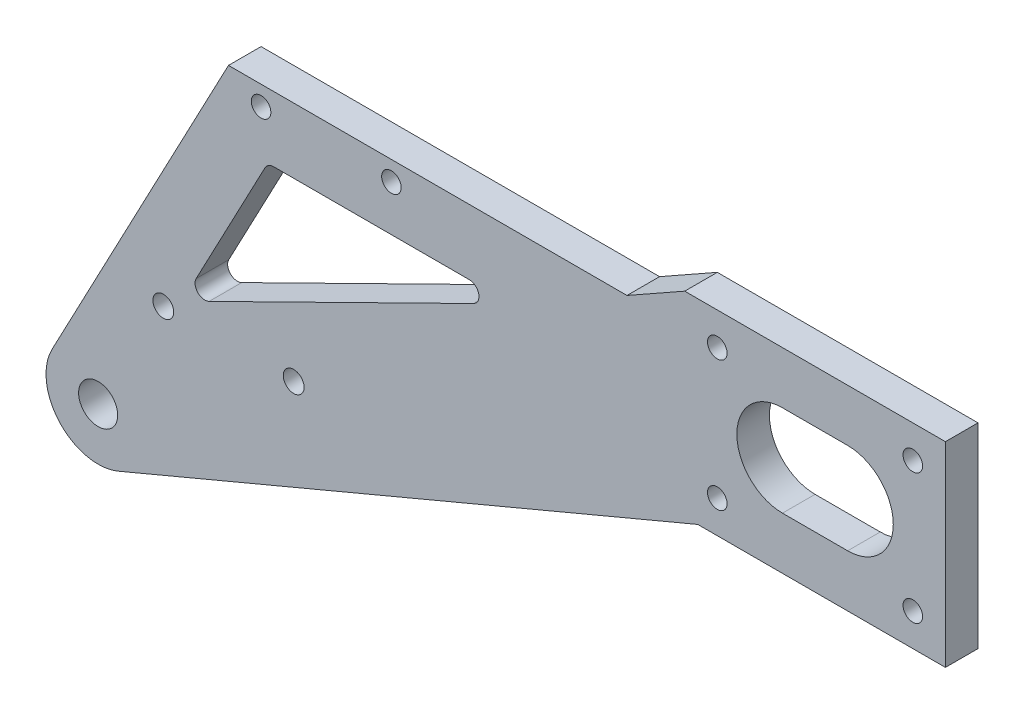
ISO-10303-21;
HEADER;
FILE_DESCRIPTION(('STEP AP214'),'2;1');
FILE_NAME('part.step','',(''),(''),'','','');
FILE_SCHEMA(('AUTOMOTIVE_DESIGN { 1 0 10303 214 1 1 1 1 }'));
ENDSEC;
DATA;
#1=APPLICATION_CONTEXT('core data for automotive mechanical design processes');
#2=APPLICATION_PROTOCOL_DEFINITION('international standard','automotive_design',2000,#1);
#3=PRODUCT_CONTEXT('',#1,'mechanical');
#4=PRODUCT('Part','Part','',(#3));
#5=PRODUCT_RELATED_PRODUCT_CATEGORY('part','',(#4));
#6=PRODUCT_DEFINITION_FORMATION('','',#4);
#7=PRODUCT_DEFINITION_CONTEXT('part definition',#1,'design');
#8=PRODUCT_DEFINITION('design','',#6,#7);
#9=PRODUCT_DEFINITION_SHAPE('','',#8);
#10=(LENGTH_UNIT() NAMED_UNIT(*) SI_UNIT(.MILLI.,.METRE.));
#11=(NAMED_UNIT(*) PLANE_ANGLE_UNIT() SI_UNIT($,.RADIAN.));
#12=(NAMED_UNIT(*) SI_UNIT($,.STERADIAN.) SOLID_ANGLE_UNIT());
#13=UNCERTAINTY_MEASURE_WITH_UNIT(LENGTH_MEASURE(1.E-05),#10,'distance_accuracy_value','');
#14=(GEOMETRIC_REPRESENTATION_CONTEXT(3) GLOBAL_UNCERTAINTY_ASSIGNED_CONTEXT((#13)) GLOBAL_UNIT_ASSIGNED_CONTEXT((#10,
#11,#12)) REPRESENTATION_CONTEXT('',''));
#15=CARTESIAN_POINT('',(0.,0.,0.));
#16=DIRECTION('',(0.,0.,1.));
#17=DIRECTION('',(1.,0.,0.));
#18=AXIS2_PLACEMENT_3D('',#15,#16,#17);
#19=CARTESIAN_POINT('',(0.,0.,5.));
#20=DIRECTION('',(0.,0.,1.));
#21=DIRECTION('',(1.,0.,0.));
#22=AXIS2_PLACEMENT_3D('',#19,#20,#21);
#23=PLANE('',#22);
#24=CARTESIAN_POINT('',(10.,18.,5.));
#25=DIRECTION('',(0.,0.,1.));
#26=DIRECTION('',(1.,0.,0.));
#27=AXIS2_PLACEMENT_3D('',#24,#25,#26);
#28=CIRCLE('',#27,1.6);
#29=CARTESIAN_POINT('',(11.6,18.,5.));
#30=VERTEX_POINT('',#29);
#31=EDGE_CURVE('E482',#30,#30,#28,.T.);
#32=ORIENTED_EDGE('',*,*,#31,.F.);
#33=EDGE_LOOP('',(#32));
#34=FACE_BOUND('',#33,.T.);
#35=CARTESIAN_POINT('',(30.,18.,5.));
#36=DIRECTION('',(0.,0.,1.));
#37=DIRECTION('',(1.,0.,0.));
#38=AXIS2_PLACEMENT_3D('',#35,#36,#37);
#39=CIRCLE('',#38,1.6);
#40=CARTESIAN_POINT('',(31.6,18.,5.));
#41=VERTEX_POINT('',#40);
#42=EDGE_CURVE('E189',#41,#41,#39,.T.);
#43=ORIENTED_EDGE('',*,*,#42,.F.);
#44=EDGE_LOOP('',(#43));
#45=FACE_BOUND('',#44,.T.);
#46=CARTESIAN_POINT('',(56.9317860296705,43.5,5.));
#47=DIRECTION('',(0.,0.,1.));
#48=DIRECTION('',(1.,0.,0.));
#49=AXIS2_PLACEMENT_3D('',#46,#47,#48);
#50=CIRCLE('',#49,1.50000000000001);
#51=CARTESIAN_POINT('',(57.5951320607567,42.1546479854543,5.));
#52=VERTEX_POINT('',#51);
#53=CARTESIAN_POINT('',(56.9317860296705,45.,5.));
#54=VERTEX_POINT('',#53);
#55=EDGE_CURVE('E51',#52,#54,#50,.T.);
#56=ORIENTED_EDGE('',*,*,#55,.F.);
#57=DIRECTION('',(0.896901343030464,0.442230687390812,0.));
#58=VECTOR('',#57,1.);
#59=CARTESIAN_POINT('',(17.0325312009098,22.1546479854543,5.));
#60=LINE('',#59,#58);
#61=CARTESIAN_POINT('',(17.0325312009098,22.1546479854543,5.));
#62=VERTEX_POINT('',#61);
#63=EDGE_CURVE('E183',#62,#52,#60,.T.);
#64=ORIENTED_EDGE('',*,*,#63,.F.);
#65=CARTESIAN_POINT('',(16.3691851698236,23.5,5.));
#66=DIRECTION('',(0.,0.,1.));
#67=DIRECTION('',(1.,0.,0.));
#68=AXIS2_PLACEMENT_3D('',#65,#66,#67);
#69=CIRCLE('',#68,1.5);
#70=CARTESIAN_POINT('',(15.0428009644484,24.2005033474091,5.));
#71=VERTEX_POINT('',#70);
#72=EDGE_CURVE('E186',#71,#62,#69,.T.);
#73=ORIENTED_EDGE('',*,*,#72,.F.);
#74=DIRECTION('',(-0.46700223160609,-0.884256136916748,0.));
#75=VECTOR('',#74,1.);
#76=CARTESIAN_POINT('',(25.6054018242954,44.2005033474091,5.));
#77=LINE('',#76,#75);
#78=CARTESIAN_POINT('',(25.6054018242954,44.2005033474091,5.));
#79=VERTEX_POINT('',#78);
#80=EDGE_CURVE('E206',#79,#71,#77,.T.);
#81=ORIENTED_EDGE('',*,*,#80,.F.);
#82=CARTESIAN_POINT('',(26.9317860296705,43.5,5.));
#83=DIRECTION('',(0.,0.,1.));
#84=DIRECTION('',(-1.,0.,0.));
#85=AXIS2_PLACEMENT_3D('',#82,#83,#84);
#86=CIRCLE('',#85,1.5);
#87=CARTESIAN_POINT('',(26.9317860296705,45.,5.));
#88=VERTEX_POINT('',#87);
#89=EDGE_CURVE('E203',#88,#79,#86,.T.);
#90=ORIENTED_EDGE('',*,*,#89,.F.);
#91=DIRECTION('',(-1.,0.,0.));
#92=VECTOR('',#91,1.);
#93=CARTESIAN_POINT('',(56.9317860296705,45.,5.));
#94=LINE('',#93,#92);
#95=EDGE_CURVE('E200',#54,#88,#94,.T.);
#96=ORIENTED_EDGE('',*,*,#95,.F.);
#97=EDGE_LOOP('',(#56,#64,#73,#81,#90,#96));
#98=FACE_BOUND('',#97,.T.);
#99=CARTESIAN_POINT('',(105.,45.,5.));
#100=DIRECTION('',(0.,0.,1.));
#101=DIRECTION('',(1.,0.,0.));
#102=AXIS2_PLACEMENT_3D('',#99,#100,#101);
#103=CIRCLE('',#102,7.);
#104=CARTESIAN_POINT('',(105.,52.,5.));
#105=VERTEX_POINT('',#104);
#106=CARTESIAN_POINT('',(105.,38.,5.));
#107=VERTEX_POINT('',#106);
#108=EDGE_CURVE('E59',#105,#107,#103,.T.);
#109=ORIENTED_EDGE('',*,*,#108,.F.);
#110=DIRECTION('',(-1.,0.,0.));
#111=VECTOR('',#110,1.);
#112=CARTESIAN_POINT('',(105.,52.,5.));
#113=LINE('',#112,#111);
#114=CARTESIAN_POINT('',(115.,52.,5.));
#115=VERTEX_POINT('',#114);
#116=EDGE_CURVE('E225',#115,#105,#113,.T.);
#117=ORIENTED_EDGE('',*,*,#116,.F.);
#118=CARTESIAN_POINT('',(115.,45.,5.));
#119=DIRECTION('',(0.,0.,1.));
#120=DIRECTION('',(1.,0.,0.));
#121=AXIS2_PLACEMENT_3D('',#118,#119,#120);
#122=CIRCLE('',#121,7.);
#123=CARTESIAN_POINT('',(115.,38.,5.));
#124=VERTEX_POINT('',#123);
#125=EDGE_CURVE('E240',#124,#115,#122,.T.);
#126=ORIENTED_EDGE('',*,*,#125,.F.);
#127=DIRECTION('',(1.,0.,0.));
#128=VECTOR('',#127,1.);
#129=CARTESIAN_POINT('',(105.,38.,5.));
#130=LINE('',#129,#128);
#131=EDGE_CURVE('E236',#107,#124,#130,.T.);
#132=ORIENTED_EDGE('',*,*,#131,.F.);
#133=EDGE_LOOP('',(#109,#117,#126,#132));
#134=FACE_BOUND('',#133,.T.);
#135=DIRECTION('',(-0.46700223160609,-0.884256136916748,0.));
#136=VECTOR('',#135,1.);
#137=CARTESIAN_POINT('',(-7.07404909533399,3.73601785284872,5.));
#138=LINE('',#137,#136);
#139=CARTESIAN_POINT('',(20.,55.,5.));
#140=VERTEX_POINT('',#139);
#141=CARTESIAN_POINT('',(-7.07404909533399,3.73601785284872,5.));
#142=VERTEX_POINT('',#141);
#143=EDGE_CURVE('E213',#140,#142,#138,.T.);
#144=ORIENTED_EDGE('',*,*,#143,.T.);
#145=CARTESIAN_POINT('',(0.,0.,5.));
#146=DIRECTION('',(0.,0.,1.));
#147=DIRECTION('',(1.,0.,0.));
#148=AXIS2_PLACEMENT_3D('',#145,#146,#147);
#149=CIRCLE('',#148,8.);
#150=CARTESIAN_POINT('',(3.10046580802895,-7.37476181128878,5.));
#151=VERTEX_POINT('',#150);
#152=EDGE_CURVE('E311',#142,#151,#149,.T.);
#153=ORIENTED_EDGE('',*,*,#152,.T.);
#154=DIRECTION('',(0.921845226411098,0.387558226003619,0.));
#155=VECTOR('',#154,1.);
#156=CARTESIAN_POINT('',(92.,30.,5.));
#157=LINE('',#156,#155);
#158=CARTESIAN_POINT('',(92.,30.,5.));
#159=VERTEX_POINT('',#158);
#160=EDGE_CURVE('E313',#151,#159,#157,.T.);
#161=ORIENTED_EDGE('',*,*,#160,.T.);
#162=DIRECTION('',(1.,0.,0.));
#163=VECTOR('',#162,1.);
#164=CARTESIAN_POINT('',(92.,30.,5.));
#165=LINE('',#164,#163);
#166=CARTESIAN_POINT('',(130.,30.,5.));
#167=VERTEX_POINT('',#166);
#168=EDGE_CURVE('E316',#159,#167,#165,.T.);
#169=ORIENTED_EDGE('',*,*,#168,.T.);
#170=DIRECTION('',(0.,1.,0.));
#171=VECTOR('',#170,1.);
#172=CARTESIAN_POINT('',(130.,60.,5.));
#173=LINE('',#172,#171);
#174=CARTESIAN_POINT('',(130.,60.,5.));
#175=VERTEX_POINT('',#174);
#176=EDGE_CURVE('E318',#167,#175,#173,.T.);
#177=ORIENTED_EDGE('',*,*,#176,.T.);
#178=DIRECTION('',(-1.,0.,0.));
#179=VECTOR('',#178,1.);
#180=CARTESIAN_POINT('',(90.,60.,5.));
#181=LINE('',#180,#179);
#182=CARTESIAN_POINT('',(90.,60.,5.));
#183=VERTEX_POINT('',#182);
#184=EDGE_CURVE('E320',#175,#183,#181,.T.);
#185=ORIENTED_EDGE('',*,*,#184,.T.);
#186=DIRECTION('',(-0.870797121650983,-0.4916425255451,0.));
#187=VECTOR('',#186,1.);
#188=CARTESIAN_POINT('',(-3.9331402043608,6.96637697320786,5.));
#189=LINE('',#188,#187);
#190=CARTESIAN_POINT('',(81.1440012162749,55.,5.));
#191=VERTEX_POINT('',#190);
#192=EDGE_CURVE('E322',#183,#191,#189,.T.);
#193=ORIENTED_EDGE('',*,*,#192,.T.);
#194=DIRECTION('',(-1.,0.,0.));
#195=VECTOR('',#194,1.);
#196=CARTESIAN_POINT('',(81.1440012162749,55.,5.));
#197=LINE('',#196,#195);
#198=EDGE_CURVE('E261',#191,#140,#197,.T.);
#199=ORIENTED_EDGE('',*,*,#198,.T.);
#200=EDGE_LOOP('',(#144,#153,#161,#169,#177,#185,#193,#199));
#201=FACE_BOUND('',#200,.T.);
#202=CARTESIAN_POINT('',(25.,52.,5.));
#203=DIRECTION('',(0.,0.,1.));
#204=DIRECTION('',(1.,0.,0.));
#205=AXIS2_PLACEMENT_3D('',#202,#203,#204);
#206=CIRCLE('',#205,1.5);
#207=CARTESIAN_POINT('',(26.5,52.,5.));
#208=VERTEX_POINT('',#207);
#209=EDGE_CURVE('E262',#208,#208,#206,.T.);
#210=ORIENTED_EDGE('',*,*,#209,.F.);
#211=EDGE_LOOP('',(#210));
#212=FACE_BOUND('',#211,.T.);
#213=CARTESIAN_POINT('',(45.,52.,5.));
#214=DIRECTION('',(0.,0.,1.));
#215=DIRECTION('',(1.,0.,0.));
#216=AXIS2_PLACEMENT_3D('',#213,#214,#215);
#217=CIRCLE('',#216,1.5);
#218=CARTESIAN_POINT('',(46.5,52.,5.));
#219=VERTEX_POINT('',#218);
#220=EDGE_CURVE('E253',#219,#219,#217,.T.);
#221=ORIENTED_EDGE('',*,*,#220,.F.);
#222=EDGE_LOOP('',(#221));
#223=FACE_BOUND('',#222,.T.);
#224=CARTESIAN_POINT('',(125.,35.,5.));
#225=DIRECTION('',(0.,0.,1.));
#226=DIRECTION('',(1.,0.,0.));
#227=AXIS2_PLACEMENT_3D('',#224,#225,#226);
#228=CIRCLE('',#227,1.5);
#229=CARTESIAN_POINT('',(126.5,35.,5.));
#230=VERTEX_POINT('',#229);
#231=EDGE_CURVE('E287',#230,#230,#228,.T.);
#232=ORIENTED_EDGE('',*,*,#231,.F.);
#233=EDGE_LOOP('',(#232));
#234=FACE_BOUND('',#233,.T.);
#235=CARTESIAN_POINT('',(125.,55.,5.));
#236=DIRECTION('',(0.,0.,1.));
#237=DIRECTION('',(1.,0.,0.));
#238=AXIS2_PLACEMENT_3D('',#235,#236,#237);
#239=CIRCLE('',#238,1.5);
#240=CARTESIAN_POINT('',(126.5,55.,5.));
#241=VERTEX_POINT('',#240);
#242=EDGE_CURVE('E299',#241,#241,#239,.T.);
#243=ORIENTED_EDGE('',*,*,#242,.F.);
#244=EDGE_LOOP('',(#243));
#245=FACE_BOUND('',#244,.T.);
#246=CARTESIAN_POINT('',(0.,0.,5.));
#247=DIRECTION('',(0.,0.,1.));
#248=DIRECTION('',(1.,0.,0.));
#249=AXIS2_PLACEMENT_3D('',#246,#247,#248);
#250=CIRCLE('',#249,3.);
#251=CARTESIAN_POINT('',(3.,0.,5.));
#252=VERTEX_POINT('',#251);
#253=EDGE_CURVE('E305',#252,#252,#250,.T.);
#254=ORIENTED_EDGE('',*,*,#253,.F.);
#255=EDGE_LOOP('',(#254));
#256=FACE_BOUND('',#255,.T.);
#257=CARTESIAN_POINT('',(95.,55.,5.));
#258=DIRECTION('',(0.,0.,1.));
#259=DIRECTION('',(1.,0.,0.));
#260=AXIS2_PLACEMENT_3D('',#257,#258,#259);
#261=CIRCLE('',#260,1.5);
#262=CARTESIAN_POINT('',(96.5,55.,5.));
#263=VERTEX_POINT('',#262);
#264=EDGE_CURVE('E293',#263,#263,#261,.T.);
#265=ORIENTED_EDGE('',*,*,#264,.F.);
#266=EDGE_LOOP('',(#265));
#267=FACE_BOUND('',#266,.T.);
#268=CARTESIAN_POINT('',(95.,35.,5.));
#269=DIRECTION('',(0.,0.,1.));
#270=DIRECTION('',(1.,0.,0.));
#271=AXIS2_PLACEMENT_3D('',#268,#269,#270);
#272=CIRCLE('',#271,1.5);
#273=CARTESIAN_POINT('',(96.5,35.,5.));
#274=VERTEX_POINT('',#273);
#275=EDGE_CURVE('E281',#274,#274,#272,.T.);
#276=ORIENTED_EDGE('',*,*,#275,.F.);
#277=EDGE_LOOP('',(#276));
#278=FACE_BOUND('',#277,.T.);
#279=ADVANCED_FACE('F36',(#34,#45,#98,#134,#201,#212,#223,#234,#245,#256,#267,#278),#23,.T.);
#280=CARTESIAN_POINT('',(0.,0.,0.));
#281=DIRECTION('',(0.,0.,1.));
#282=DIRECTION('',(1.,0.,0.));
#283=AXIS2_PLACEMENT_3D('',#280,#281,#282);
#284=PLANE('',#283);
#285=CARTESIAN_POINT('',(10.,18.,0.));
#286=DIRECTION('',(0.,0.,1.));
#287=DIRECTION('',(1.,0.,0.));
#288=AXIS2_PLACEMENT_3D('',#285,#286,#287);
#289=CIRCLE('',#288,1.6);
#290=CARTESIAN_POINT('',(11.6,18.,0.));
#291=VERTEX_POINT('',#290);
#292=EDGE_CURVE('E237',#291,#291,#289,.T.);
#293=ORIENTED_EDGE('',*,*,#292,.T.);
#294=EDGE_LOOP('',(#293));
#295=FACE_BOUND('',#294,.T.);
#296=CARTESIAN_POINT('',(30.,18.,0.));
#297=DIRECTION('',(0.,0.,1.));
#298=DIRECTION('',(1.,0.,0.));
#299=AXIS2_PLACEMENT_3D('',#296,#297,#298);
#300=CIRCLE('',#299,1.6);
#301=CARTESIAN_POINT('',(31.6,18.,0.));
#302=VERTEX_POINT('',#301);
#303=EDGE_CURVE('E483',#302,#302,#300,.T.);
#304=ORIENTED_EDGE('',*,*,#303,.T.);
#305=EDGE_LOOP('',(#304));
#306=FACE_BOUND('',#305,.T.);
#307=DIRECTION('',(0.896901343030464,0.442230687390812,0.));
#308=VECTOR('',#307,1.);
#309=CARTESIAN_POINT('',(17.0325312009098,22.1546479854543,0.));
#310=LINE('',#309,#308);
#311=CARTESIAN_POINT('',(17.0325312009098,22.1546479854543,0.));
#312=VERTEX_POINT('',#311);
#313=CARTESIAN_POINT('',(57.5951320607567,42.1546479854543,0.));
#314=VERTEX_POINT('',#313);
#315=EDGE_CURVE('E169',#312,#314,#310,.T.);
#316=ORIENTED_EDGE('',*,*,#315,.T.);
#317=CARTESIAN_POINT('',(56.9317860296705,43.5,0.));
#318=DIRECTION('',(0.,0.,1.));
#319=DIRECTION('',(1.,0.,0.));
#320=AXIS2_PLACEMENT_3D('',#317,#318,#319);
#321=CIRCLE('',#320,1.50000000000001);
#322=CARTESIAN_POINT('',(56.9317860296705,45.,0.));
#323=VERTEX_POINT('',#322);
#324=EDGE_CURVE('E163',#314,#323,#321,.T.);
#325=ORIENTED_EDGE('',*,*,#324,.T.);
#326=DIRECTION('',(-1.,0.,0.));
#327=VECTOR('',#326,1.);
#328=CARTESIAN_POINT('',(56.9317860296705,45.,0.));
#329=LINE('',#328,#327);
#330=CARTESIAN_POINT('',(26.9317860296705,45.,0.));
#331=VERTEX_POINT('',#330);
#332=EDGE_CURVE('E173',#323,#331,#329,.T.);
#333=ORIENTED_EDGE('',*,*,#332,.T.);
#334=CARTESIAN_POINT('',(26.9317860296705,43.5,0.));
#335=DIRECTION('',(0.,0.,1.));
#336=DIRECTION('',(-1.,0.,0.));
#337=AXIS2_PLACEMENT_3D('',#334,#335,#336);
#338=CIRCLE('',#337,1.5);
#339=CARTESIAN_POINT('',(25.6054018242954,44.2005033474091,0.));
#340=VERTEX_POINT('',#339);
#341=EDGE_CURVE('E177',#331,#340,#338,.T.);
#342=ORIENTED_EDGE('',*,*,#341,.T.);
#343=DIRECTION('',(-0.46700223160609,-0.884256136916748,0.));
#344=VECTOR('',#343,1.);
#345=CARTESIAN_POINT('',(25.6054018242954,44.2005033474091,0.));
#346=LINE('',#345,#344);
#347=CARTESIAN_POINT('',(15.0428009644484,24.2005033474091,0.));
#348=VERTEX_POINT('',#347);
#349=EDGE_CURVE('E193',#340,#348,#346,.T.);
#350=ORIENTED_EDGE('',*,*,#349,.T.);
#351=CARTESIAN_POINT('',(16.3691851698236,23.5,0.));
#352=DIRECTION('',(0.,0.,1.));
#353=DIRECTION('',(1.,0.,0.));
#354=AXIS2_PLACEMENT_3D('',#351,#352,#353);
#355=CIRCLE('',#354,1.5);
#356=EDGE_CURVE('E196',#348,#312,#355,.T.);
#357=ORIENTED_EDGE('',*,*,#356,.T.);
#358=EDGE_LOOP('',(#316,#325,#333,#342,#350,#357));
#359=FACE_BOUND('',#358,.T.);
#360=DIRECTION('',(-1.,0.,0.));
#361=VECTOR('',#360,1.);
#362=CARTESIAN_POINT('',(105.,52.,0.));
#363=LINE('',#362,#361);
#364=CARTESIAN_POINT('',(115.,52.,0.));
#365=VERTEX_POINT('',#364);
#366=CARTESIAN_POINT('',(105.,52.,0.));
#367=VERTEX_POINT('',#366);
#368=EDGE_CURVE('E231',#365,#367,#363,.T.);
#369=ORIENTED_EDGE('',*,*,#368,.T.);
#370=CARTESIAN_POINT('',(105.,45.,0.));
#371=DIRECTION('',(0.,0.,1.));
#372=DIRECTION('',(1.,0.,0.));
#373=AXIS2_PLACEMENT_3D('',#370,#371,#372);
#374=CIRCLE('',#373,7.);
#375=CARTESIAN_POINT('',(105.,38.,0.));
#376=VERTEX_POINT('',#375);
#377=EDGE_CURVE('E221',#367,#376,#374,.T.);
#378=ORIENTED_EDGE('',*,*,#377,.T.);
#379=DIRECTION('',(1.,0.,0.));
#380=VECTOR('',#379,1.);
#381=CARTESIAN_POINT('',(105.,38.,0.));
#382=LINE('',#381,#380);
#383=CARTESIAN_POINT('',(115.,38.,0.));
#384=VERTEX_POINT('',#383);
#385=EDGE_CURVE('E224',#376,#384,#382,.T.);
#386=ORIENTED_EDGE('',*,*,#385,.T.);
#387=CARTESIAN_POINT('',(115.,45.,0.));
#388=DIRECTION('',(0.,0.,1.));
#389=DIRECTION('',(1.,0.,0.));
#390=AXIS2_PLACEMENT_3D('',#387,#388,#389);
#391=CIRCLE('',#390,7.);
#392=EDGE_CURVE('E228',#384,#365,#391,.T.);
#393=ORIENTED_EDGE('',*,*,#392,.T.);
#394=EDGE_LOOP('',(#369,#378,#386,#393));
#395=FACE_BOUND('',#394,.T.);
#396=CARTESIAN_POINT('',(0.,0.,0.));
#397=DIRECTION('',(0.,0.,1.));
#398=DIRECTION('',(1.,0.,0.));
#399=AXIS2_PLACEMENT_3D('',#396,#397,#398);
#400=CIRCLE('',#399,8.);
#401=CARTESIAN_POINT('',(-7.07404909533399,3.73601785284872,0.));
#402=VERTEX_POINT('',#401);
#403=CARTESIAN_POINT('',(3.10046580802895,-7.37476181128878,0.));
#404=VERTEX_POINT('',#403);
#405=EDGE_CURVE('E308',#402,#404,#400,.T.);
#406=ORIENTED_EDGE('',*,*,#405,.F.);
#407=DIRECTION('',(0.46700223160609,0.884256136916749,0.));
#408=VECTOR('',#407,1.);
#409=CARTESIAN_POINT('',(-7.07404909533399,3.73601785284872,0.));
#410=LINE('',#409,#408);
#411=CARTESIAN_POINT('',(20.,55.,0.));
#412=VERTEX_POINT('',#411);
#413=EDGE_CURVE('E251',#402,#412,#410,.T.);
#414=ORIENTED_EDGE('',*,*,#413,.T.);
#415=DIRECTION('',(1.,0.,0.));
#416=VECTOR('',#415,1.);
#417=CARTESIAN_POINT('',(81.1440012162749,55.,0.));
#418=LINE('',#417,#416);
#419=CARTESIAN_POINT('',(81.1440012162749,55.,0.));
#420=VERTEX_POINT('',#419);
#421=EDGE_CURVE('E276',#412,#420,#418,.T.);
#422=ORIENTED_EDGE('',*,*,#421,.T.);
#423=DIRECTION('',(-0.870797121650983,-0.4916425255451,0.));
#424=VECTOR('',#423,1.);
#425=CARTESIAN_POINT('',(-3.9331402043608,6.96637697320786,0.));
#426=LINE('',#425,#424);
#427=CARTESIAN_POINT('',(90.,60.,0.));
#428=VERTEX_POINT('',#427);
#429=EDGE_CURVE('E314',#428,#420,#426,.T.);
#430=ORIENTED_EDGE('',*,*,#429,.F.);
#431=DIRECTION('',(-1.,0.,0.));
#432=VECTOR('',#431,1.);
#433=CARTESIAN_POINT('',(90.,60.,0.));
#434=LINE('',#433,#432);
#435=CARTESIAN_POINT('',(130.,60.,0.));
#436=VERTEX_POINT('',#435);
#437=EDGE_CURVE('E333',#436,#428,#434,.T.);
#438=ORIENTED_EDGE('',*,*,#437,.F.);
#439=DIRECTION('',(0.,1.,0.));
#440=VECTOR('',#439,1.);
#441=CARTESIAN_POINT('',(130.,60.,0.));
#442=LINE('',#441,#440);
#443=CARTESIAN_POINT('',(130.,30.,0.));
#444=VERTEX_POINT('',#443);
#445=EDGE_CURVE('E331',#444,#436,#442,.T.);
#446=ORIENTED_EDGE('',*,*,#445,.F.);
#447=DIRECTION('',(1.,0.,0.));
#448=VECTOR('',#447,1.);
#449=CARTESIAN_POINT('',(92.,30.,0.));
#450=LINE('',#449,#448);
#451=CARTESIAN_POINT('',(92.,30.,0.));
#452=VERTEX_POINT('',#451);
#453=EDGE_CURVE('E329',#452,#444,#450,.T.);
#454=ORIENTED_EDGE('',*,*,#453,.F.);
#455=DIRECTION('',(0.921845226411098,0.387558226003619,0.));
#456=VECTOR('',#455,1.);
#457=CARTESIAN_POINT('',(92.,30.,0.));
#458=LINE('',#457,#456);
#459=EDGE_CURVE('E327',#404,#452,#458,.T.);
#460=ORIENTED_EDGE('',*,*,#459,.F.);
#461=EDGE_LOOP('',(#406,#414,#422,#430,#438,#446,#454,#460));
#462=FACE_BOUND('',#461,.T.);
#463=CARTESIAN_POINT('',(25.,52.,0.));
#464=DIRECTION('',(0.,0.,1.));
#465=DIRECTION('',(1.,0.,0.));
#466=AXIS2_PLACEMENT_3D('',#463,#464,#465);
#467=CIRCLE('',#466,1.5);
#468=CARTESIAN_POINT('',(26.5,52.,0.));
#469=VERTEX_POINT('',#468);
#470=EDGE_CURVE('E258',#469,#469,#467,.T.);
#471=ORIENTED_EDGE('',*,*,#470,.T.);
#472=EDGE_LOOP('',(#471));
#473=FACE_BOUND('',#472,.T.);
#474=CARTESIAN_POINT('',(45.,52.,0.));
#475=DIRECTION('',(0.,0.,1.));
#476=DIRECTION('',(1.,0.,0.));
#477=AXIS2_PLACEMENT_3D('',#474,#475,#476);
#478=CIRCLE('',#477,1.5);
#479=CARTESIAN_POINT('',(46.5,52.,0.));
#480=VERTEX_POINT('',#479);
#481=EDGE_CURVE('E265',#480,#480,#478,.T.);
#482=ORIENTED_EDGE('',*,*,#481,.T.);
#483=EDGE_LOOP('',(#482));
#484=FACE_BOUND('',#483,.T.);
#485=CARTESIAN_POINT('',(0.,0.,0.));
#486=DIRECTION('',(0.,0.,1.));
#487=DIRECTION('',(1.,0.,0.));
#488=AXIS2_PLACEMENT_3D('',#485,#486,#487);
#489=CIRCLE('',#488,3.);
#490=CARTESIAN_POINT('',(3.,0.,0.));
#491=VERTEX_POINT('',#490);
#492=EDGE_CURVE('E302',#491,#491,#489,.T.);
#493=ORIENTED_EDGE('',*,*,#492,.T.);
#494=EDGE_LOOP('',(#493));
#495=FACE_BOUND('',#494,.T.);
#496=CARTESIAN_POINT('',(125.,55.,0.));
#497=DIRECTION('',(0.,0.,1.));
#498=DIRECTION('',(1.,0.,0.));
#499=AXIS2_PLACEMENT_3D('',#496,#497,#498);
#500=CIRCLE('',#499,1.5);
#501=CARTESIAN_POINT('',(126.5,55.,0.));
#502=VERTEX_POINT('',#501);
#503=EDGE_CURVE('E296',#502,#502,#500,.T.);
#504=ORIENTED_EDGE('',*,*,#503,.T.);
#505=EDGE_LOOP('',(#504));
#506=FACE_BOUND('',#505,.T.);
#507=CARTESIAN_POINT('',(95.,55.,0.));
#508=DIRECTION('',(0.,0.,1.));
#509=DIRECTION('',(1.,0.,0.));
#510=AXIS2_PLACEMENT_3D('',#507,#508,#509);
#511=CIRCLE('',#510,1.5);
#512=CARTESIAN_POINT('',(96.5,55.,0.));
#513=VERTEX_POINT('',#512);
#514=EDGE_CURVE('E290',#513,#513,#511,.T.);
#515=ORIENTED_EDGE('',*,*,#514,.T.);
#516=EDGE_LOOP('',(#515));
#517=FACE_BOUND('',#516,.T.);
#518=CARTESIAN_POINT('',(125.,35.,0.));
#519=DIRECTION('',(0.,0.,1.));
#520=DIRECTION('',(1.,0.,0.));
#521=AXIS2_PLACEMENT_3D('',#518,#519,#520);
#522=CIRCLE('',#521,1.5);
#523=CARTESIAN_POINT('',(126.5,35.,0.));
#524=VERTEX_POINT('',#523);
#525=EDGE_CURVE('E284',#524,#524,#522,.T.);
#526=ORIENTED_EDGE('',*,*,#525,.T.);
#527=EDGE_LOOP('',(#526));
#528=FACE_BOUND('',#527,.T.);
#529=CARTESIAN_POINT('',(95.,35.,0.));
#530=DIRECTION('',(0.,0.,1.));
#531=DIRECTION('',(1.,0.,0.));
#532=AXIS2_PLACEMENT_3D('',#529,#530,#531);
#533=CIRCLE('',#532,1.5);
#534=CARTESIAN_POINT('',(96.5,35.,0.));
#535=VERTEX_POINT('',#534);
#536=EDGE_CURVE('E280',#535,#535,#533,.T.);
#537=ORIENTED_EDGE('',*,*,#536,.T.);
#538=EDGE_LOOP('',(#537));
#539=FACE_BOUND('',#538,.T.);
#540=ADVANCED_FACE('F179',(#295,#306,#359,#395,#462,#473,#484,#495,#506,#517,#528,#539),#284,.F.);
#541=CARTESIAN_POINT('',(0.,0.,5.));
#542=DIRECTION('',(0.,0.,-1.));
#543=DIRECTION('',(-1.,0.,0.));
#544=AXIS2_PLACEMENT_3D('',#541,#542,#543);
#545=CYLINDRICAL_SURFACE('',#544,8.);
#546=ORIENTED_EDGE('',*,*,#152,.F.);
#547=DIRECTION('',(0.,0.,1.));
#548=VECTOR('',#547,1.);
#549=CARTESIAN_POINT('',(-7.07404909533399,3.73601785284872,-57.974132162543));
#550=LINE('',#549,#548);
#551=EDGE_CURVE('E254',#402,#142,#550,.T.);
#552=ORIENTED_EDGE('',*,*,#551,.F.);
#553=ORIENTED_EDGE('',*,*,#405,.T.);
#554=DIRECTION('',(0.,0.,-1.));
#555=VECTOR('',#554,1.);
#556=CARTESIAN_POINT('',(3.10046580802895,-7.37476181128878,5.));
#557=LINE('',#556,#555);
#558=EDGE_CURVE('E11',#151,#404,#557,.T.);
#559=ORIENTED_EDGE('',*,*,#558,.F.);
#560=EDGE_LOOP('',(#546,#552,#553,#559));
#561=FACE_BOUND('',#560,.T.);
#562=ADVANCED_FACE('F38',(#561),#545,.T.);
#563=CARTESIAN_POINT('',(92.,30.,5.));
#564=DIRECTION('',(-0.387558226003619,0.921845226411098,0.));
#565=DIRECTION('',(-0.921845226411098,-0.387558226003619,0.));
#566=AXIS2_PLACEMENT_3D('',#563,#564,#565);
#567=PLANE('',#566);
#568=ORIENTED_EDGE('',*,*,#459,.T.);
#569=DIRECTION('',(0.,0.,-1.));
#570=VECTOR('',#569,1.);
#571=CARTESIAN_POINT('',(92.,30.,5.));
#572=LINE('',#571,#570);
#573=EDGE_CURVE('E44',#159,#452,#572,.T.);
#574=ORIENTED_EDGE('',*,*,#573,.F.);
#575=ORIENTED_EDGE('',*,*,#160,.F.);
#576=ORIENTED_EDGE('',*,*,#558,.T.);
#577=EDGE_LOOP('',(#568,#574,#575,#576));
#578=FACE_BOUND('',#577,.T.);
#579=ADVANCED_FACE('F373',(#578),#567,.F.);
#580=CARTESIAN_POINT('',(92.,30.,5.));
#581=DIRECTION('',(0.,1.,0.));
#582=DIRECTION('',(0.,0.,1.));
#583=AXIS2_PLACEMENT_3D('',#580,#581,#582);
#584=PLANE('',#583);
#585=ORIENTED_EDGE('',*,*,#453,.T.);
#586=DIRECTION('',(0.,0.,-1.));
#587=VECTOR('',#586,1.);
#588=CARTESIAN_POINT('',(130.,30.,5.));
#589=LINE('',#588,#587);
#590=EDGE_CURVE('E341',#167,#444,#589,.T.);
#591=ORIENTED_EDGE('',*,*,#590,.F.);
#592=ORIENTED_EDGE('',*,*,#168,.F.);
#593=ORIENTED_EDGE('',*,*,#573,.T.);
#594=EDGE_LOOP('',(#585,#591,#592,#593));
#595=FACE_BOUND('',#594,.T.);
#596=ADVANCED_FACE('F348',(#595),#584,.F.);
#597=CARTESIAN_POINT('',(130.,60.,5.));
#598=DIRECTION('',(-1.,0.,0.));
#599=DIRECTION('',(0.,-1.,0.));
#600=AXIS2_PLACEMENT_3D('',#597,#598,#599);
#601=PLANE('',#600);
#602=ORIENTED_EDGE('',*,*,#445,.T.);
#603=DIRECTION('',(0.,0.,-1.));
#604=VECTOR('',#603,1.);
#605=CARTESIAN_POINT('',(130.,60.,5.));
#606=LINE('',#605,#604);
#607=EDGE_CURVE('E338',#175,#436,#606,.T.);
#608=ORIENTED_EDGE('',*,*,#607,.F.);
#609=ORIENTED_EDGE('',*,*,#176,.F.);
#610=ORIENTED_EDGE('',*,*,#590,.T.);
#611=EDGE_LOOP('',(#602,#608,#609,#610));
#612=FACE_BOUND('',#611,.T.);
#613=ADVANCED_FACE('F361',(#612),#601,.F.);
#614=CARTESIAN_POINT('',(90.,60.,5.));
#615=DIRECTION('',(0.,-1.,0.));
#616=DIRECTION('',(0.,0.,-1.));
#617=AXIS2_PLACEMENT_3D('',#614,#615,#616);
#618=PLANE('',#617);
#619=ORIENTED_EDGE('',*,*,#437,.T.);
#620=DIRECTION('',(0.,0.,-1.));
#621=VECTOR('',#620,1.);
#622=CARTESIAN_POINT('',(90.,60.,5.));
#623=LINE('',#622,#621);
#624=EDGE_CURVE('E325',#183,#428,#623,.T.);
#625=ORIENTED_EDGE('',*,*,#624,.F.);
#626=ORIENTED_EDGE('',*,*,#184,.F.);
#627=ORIENTED_EDGE('',*,*,#607,.T.);
#628=EDGE_LOOP('',(#619,#625,#626,#627));
#629=FACE_BOUND('',#628,.T.);
#630=ADVANCED_FACE('F365',(#629),#618,.F.);
#631=CARTESIAN_POINT('',(-3.9331402043608,6.96637697320786,5.));
#632=DIRECTION('',(0.4916425255451,-0.870797121650983,0.));
#633=DIRECTION('',(0.870797121650983,0.4916425255451,0.));
#634=AXIS2_PLACEMENT_3D('',#631,#632,#633);
#635=PLANE('',#634);
#636=ORIENTED_EDGE('',*,*,#429,.T.);
#637=DIRECTION('',(0.,0.,1.));
#638=VECTOR('',#637,1.);
#639=CARTESIAN_POINT('',(81.1440012162749,55.,-70.2161269209863));
#640=LINE('',#639,#638);
#641=EDGE_CURVE('E272',#420,#191,#640,.T.);
#642=ORIENTED_EDGE('',*,*,#641,.T.);
#643=ORIENTED_EDGE('',*,*,#192,.F.);
#644=ORIENTED_EDGE('',*,*,#624,.T.);
#645=EDGE_LOOP('',(#636,#642,#643,#644));
#646=FACE_BOUND('',#645,.T.);
#647=ADVANCED_FACE('F384',(#646),#635,.F.);
#648=CARTESIAN_POINT('',(0.,0.,5.));
#649=DIRECTION('',(0.,0.,-1.));
#650=DIRECTION('',(-1.,0.,0.));
#651=AXIS2_PLACEMENT_3D('',#648,#649,#650);
#652=CYLINDRICAL_SURFACE('',#651,3.);
#653=ORIENTED_EDGE('',*,*,#253,.T.);
#654=EDGE_LOOP('',(#653));
#655=FACE_BOUND('',#654,.T.);
#656=ORIENTED_EDGE('',*,*,#492,.F.);
#657=EDGE_LOOP('',(#656));
#658=FACE_BOUND('',#657,.T.);
#659=ADVANCED_FACE('F386',(#655,#658),#652,.F.);
#660=CARTESIAN_POINT('',(125.,55.,5.));
#661=DIRECTION('',(0.,0.,-1.));
#662=DIRECTION('',(-1.,0.,0.));
#663=AXIS2_PLACEMENT_3D('',#660,#661,#662);
#664=CYLINDRICAL_SURFACE('',#663,1.5);
#665=ORIENTED_EDGE('',*,*,#242,.T.);
#666=EDGE_LOOP('',(#665));
#667=FACE_BOUND('',#666,.T.);
#668=ORIENTED_EDGE('',*,*,#503,.F.);
#669=EDGE_LOOP('',(#668));
#670=FACE_BOUND('',#669,.T.);
#671=ADVANCED_FACE('F392',(#667,#670),#664,.F.);
#672=CARTESIAN_POINT('',(95.,55.,5.));
#673=DIRECTION('',(0.,0.,-1.));
#674=DIRECTION('',(-1.,0.,0.));
#675=AXIS2_PLACEMENT_3D('',#672,#673,#674);
#676=CYLINDRICAL_SURFACE('',#675,1.5);
#677=ORIENTED_EDGE('',*,*,#264,.T.);
#678=EDGE_LOOP('',(#677));
#679=FACE_BOUND('',#678,.T.);
#680=ORIENTED_EDGE('',*,*,#514,.F.);
#681=EDGE_LOOP('',(#680));
#682=FACE_BOUND('',#681,.T.);
#683=ADVANCED_FACE('F409',(#679,#682),#676,.F.);
#684=CARTESIAN_POINT('',(125.,35.,5.));
#685=DIRECTION('',(0.,0.,-1.));
#686=DIRECTION('',(-1.,0.,0.));
#687=AXIS2_PLACEMENT_3D('',#684,#685,#686);
#688=CYLINDRICAL_SURFACE('',#687,1.5);
#689=ORIENTED_EDGE('',*,*,#231,.T.);
#690=EDGE_LOOP('',(#689));
#691=FACE_BOUND('',#690,.T.);
#692=ORIENTED_EDGE('',*,*,#525,.F.);
#693=EDGE_LOOP('',(#692));
#694=FACE_BOUND('',#693,.T.);
#695=ADVANCED_FACE('F413',(#691,#694),#688,.F.);
#696=CARTESIAN_POINT('',(95.,35.,5.));
#697=DIRECTION('',(0.,0.,-1.));
#698=DIRECTION('',(-1.,0.,0.));
#699=AXIS2_PLACEMENT_3D('',#696,#697,#698);
#700=CYLINDRICAL_SURFACE('',#699,1.5);
#701=ORIENTED_EDGE('',*,*,#275,.T.);
#702=EDGE_LOOP('',(#701));
#703=FACE_BOUND('',#702,.T.);
#704=ORIENTED_EDGE('',*,*,#536,.F.);
#705=EDGE_LOOP('',(#704));
#706=FACE_BOUND('',#705,.T.);
#707=ADVANCED_FACE('F417',(#703,#706),#700,.F.);
#708=CARTESIAN_POINT('',(81.1440012162749,55.,-70.2161269209863));
#709=DIRECTION('',(0.,1.,0.));
#710=DIRECTION('',(-1.,0.,0.));
#711=AXIS2_PLACEMENT_3D('',#708,#709,#710);
#712=PLANE('',#711);
#713=ORIENTED_EDGE('',*,*,#421,.F.);
#714=DIRECTION('',(0.,0.,1.));
#715=VECTOR('',#714,1.);
#716=CARTESIAN_POINT('',(20.,55.,-70.2161269209863));
#717=LINE('',#716,#715);
#718=EDGE_CURVE('E273',#412,#140,#717,.T.);
#719=ORIENTED_EDGE('',*,*,#718,.T.);
#720=ORIENTED_EDGE('',*,*,#198,.F.);
#721=ORIENTED_EDGE('',*,*,#641,.F.);
#722=EDGE_LOOP('',(#713,#719,#720,#721));
#723=FACE_BOUND('',#722,.T.);
#724=ADVANCED_FACE('F382',(#723),#712,.T.);
#725=CARTESIAN_POINT('',(45.,52.,0.));
#726=DIRECTION('',(0.,0.,1.));
#727=DIRECTION('',(1.,0.,0.));
#728=AXIS2_PLACEMENT_3D('',#725,#726,#727);
#729=CYLINDRICAL_SURFACE('',#728,1.5);
#730=ORIENTED_EDGE('',*,*,#481,.F.);
#731=EDGE_LOOP('',(#730));
#732=FACE_BOUND('',#731,.T.);
#733=ORIENTED_EDGE('',*,*,#220,.T.);
#734=EDGE_LOOP('',(#733));
#735=FACE_BOUND('',#734,.T.);
#736=ADVANCED_FACE('F424',(#732,#735),#729,.F.);
#737=CARTESIAN_POINT('',(25.,52.,0.));
#738=DIRECTION('',(0.,0.,1.));
#739=DIRECTION('',(1.,0.,0.));
#740=AXIS2_PLACEMENT_3D('',#737,#738,#739);
#741=CYLINDRICAL_SURFACE('',#740,1.5);
#742=ORIENTED_EDGE('',*,*,#470,.F.);
#743=EDGE_LOOP('',(#742));
#744=FACE_BOUND('',#743,.T.);
#745=ORIENTED_EDGE('',*,*,#209,.T.);
#746=EDGE_LOOP('',(#745));
#747=FACE_BOUND('',#746,.T.);
#748=ADVANCED_FACE('F427',(#744,#747),#741,.F.);
#749=CARTESIAN_POINT('',(-7.07404909533399,3.73601785284872,-57.974132162543));
#750=DIRECTION('',(-0.884256136916748,0.46700223160609,0.));
#751=DIRECTION('',(-0.46700223160609,-0.884256136916749,0.));
#752=AXIS2_PLACEMENT_3D('',#749,#750,#751);
#753=PLANE('',#752);
#754=ORIENTED_EDGE('',*,*,#413,.F.);
#755=ORIENTED_EDGE('',*,*,#551,.T.);
#756=ORIENTED_EDGE('',*,*,#143,.F.);
#757=ORIENTED_EDGE('',*,*,#718,.F.);
#758=EDGE_LOOP('',(#754,#755,#756,#757));
#759=FACE_BOUND('',#758,.T.);
#760=ADVANCED_FACE('F380',(#759),#753,.T.);
#761=CARTESIAN_POINT('',(105.,45.,0.));
#762=DIRECTION('',(0.,0.,1.));
#763=DIRECTION('',(1.,0.,0.));
#764=AXIS2_PLACEMENT_3D('',#761,#762,#763);
#765=CYLINDRICAL_SURFACE('',#764,7.);
#766=ORIENTED_EDGE('',*,*,#108,.T.);
#767=DIRECTION('',(0.,0.,1.));
#768=VECTOR('',#767,1.);
#769=CARTESIAN_POINT('',(105.,38.,0.));
#770=LINE('',#769,#768);
#771=EDGE_CURVE('E234',#376,#107,#770,.T.);
#772=ORIENTED_EDGE('',*,*,#771,.F.);
#773=ORIENTED_EDGE('',*,*,#377,.F.);
#774=DIRECTION('',(0.,0.,1.));
#775=VECTOR('',#774,1.);
#776=CARTESIAN_POINT('',(105.,52.,0.));
#777=LINE('',#776,#775);
#778=EDGE_CURVE('E201',#367,#105,#777,.T.);
#779=ORIENTED_EDGE('',*,*,#778,.T.);
#780=EDGE_LOOP('',(#766,#772,#773,#779));
#781=FACE_BOUND('',#780,.T.);
#782=ADVANCED_FACE('F434',(#781),#765,.F.);
#783=CARTESIAN_POINT('',(105.,52.,0.));
#784=DIRECTION('',(0.,1.,0.));
#785=DIRECTION('',(0.,0.,1.));
#786=AXIS2_PLACEMENT_3D('',#783,#784,#785);
#787=PLANE('',#786);
#788=ORIENTED_EDGE('',*,*,#116,.T.);
#789=ORIENTED_EDGE('',*,*,#778,.F.);
#790=ORIENTED_EDGE('',*,*,#368,.F.);
#791=DIRECTION('',(0.,0.,1.));
#792=VECTOR('',#791,1.);
#793=CARTESIAN_POINT('',(115.,52.,0.));
#794=LINE('',#793,#792);
#795=EDGE_CURVE('E246',#365,#115,#794,.T.);
#796=ORIENTED_EDGE('',*,*,#795,.T.);
#797=EDGE_LOOP('',(#788,#789,#790,#796));
#798=FACE_BOUND('',#797,.T.);
#799=ADVANCED_FACE('F437',(#798),#787,.F.);
#800=CARTESIAN_POINT('',(115.,45.,0.));
#801=DIRECTION('',(0.,0.,1.));
#802=DIRECTION('',(1.,0.,0.));
#803=AXIS2_PLACEMENT_3D('',#800,#801,#802);
#804=CYLINDRICAL_SURFACE('',#803,7.);
#805=ORIENTED_EDGE('',*,*,#125,.T.);
#806=ORIENTED_EDGE('',*,*,#795,.F.);
#807=ORIENTED_EDGE('',*,*,#392,.F.);
#808=DIRECTION('',(0.,0.,1.));
#809=VECTOR('',#808,1.);
#810=CARTESIAN_POINT('',(115.,38.,0.));
#811=LINE('',#810,#809);
#812=EDGE_CURVE('E248',#384,#124,#811,.T.);
#813=ORIENTED_EDGE('',*,*,#812,.T.);
#814=EDGE_LOOP('',(#805,#806,#807,#813));
#815=FACE_BOUND('',#814,.T.);
#816=ADVANCED_FACE('F441',(#815),#804,.F.);
#817=CARTESIAN_POINT('',(105.,38.,0.));
#818=DIRECTION('',(0.,-1.,0.));
#819=DIRECTION('',(0.,0.,-1.));
#820=AXIS2_PLACEMENT_3D('',#817,#818,#819);
#821=PLANE('',#820);
#822=ORIENTED_EDGE('',*,*,#131,.T.);
#823=ORIENTED_EDGE('',*,*,#812,.F.);
#824=ORIENTED_EDGE('',*,*,#385,.F.);
#825=ORIENTED_EDGE('',*,*,#771,.T.);
#826=EDGE_LOOP('',(#822,#823,#824,#825));
#827=FACE_BOUND('',#826,.T.);
#828=ADVANCED_FACE('F438',(#827),#821,.F.);
#829=CARTESIAN_POINT('',(56.9317860296705,43.5,0.));
#830=DIRECTION('',(0.,0.,1.));
#831=DIRECTION('',(1.,0.,0.));
#832=AXIS2_PLACEMENT_3D('',#829,#830,#831);
#833=CYLINDRICAL_SURFACE('',#832,1.50000000000001);
#834=ORIENTED_EDGE('',*,*,#55,.T.);
#835=DIRECTION('',(0.,0.,1.));
#836=VECTOR('',#835,1.);
#837=CARTESIAN_POINT('',(56.9317860296705,45.,0.));
#838=LINE('',#837,#836);
#839=EDGE_CURVE('E159',#323,#54,#838,.T.);
#840=ORIENTED_EDGE('',*,*,#839,.F.);
#841=ORIENTED_EDGE('',*,*,#324,.F.);
#842=DIRECTION('',(0.,0.,1.));
#843=VECTOR('',#842,1.);
#844=CARTESIAN_POINT('',(57.5951320607567,42.1546479854543,0.));
#845=LINE('',#844,#843);
#846=EDGE_CURVE('E211',#314,#52,#845,.T.);
#847=ORIENTED_EDGE('',*,*,#846,.T.);
#848=EDGE_LOOP('',(#834,#840,#841,#847));
#849=FACE_BOUND('',#848,.T.);
#850=ADVANCED_FACE('F161',(#849),#833,.F.);
#851=CARTESIAN_POINT('',(17.0325312009098,22.1546479854543,0.));
#852=DIRECTION('',(0.442230687390812,-0.896901343030464,0.));
#853=DIRECTION('',(0.896901343030464,0.442230687390812,0.));
#854=AXIS2_PLACEMENT_3D('',#851,#852,#853);
#855=PLANE('',#854);
#856=ORIENTED_EDGE('',*,*,#63,.T.);
#857=ORIENTED_EDGE('',*,*,#846,.F.);
#858=ORIENTED_EDGE('',*,*,#315,.F.);
#859=DIRECTION('',(0.,0.,1.));
#860=VECTOR('',#859,1.);
#861=CARTESIAN_POINT('',(17.0325312009098,22.1546479854543,0.));
#862=LINE('',#861,#860);
#863=EDGE_CURVE('E214',#312,#62,#862,.T.);
#864=ORIENTED_EDGE('',*,*,#863,.T.);
#865=EDGE_LOOP('',(#856,#857,#858,#864));
#866=FACE_BOUND('',#865,.T.);
#867=ADVANCED_FACE('F451',(#866),#855,.F.);
#868=CARTESIAN_POINT('',(16.3691851698236,23.5,0.));
#869=DIRECTION('',(0.,0.,1.));
#870=DIRECTION('',(1.,0.,0.));
#871=AXIS2_PLACEMENT_3D('',#868,#869,#870);
#872=CYLINDRICAL_SURFACE('',#871,1.5);
#873=ORIENTED_EDGE('',*,*,#72,.T.);
#874=ORIENTED_EDGE('',*,*,#863,.F.);
#875=ORIENTED_EDGE('',*,*,#356,.F.);
#876=DIRECTION('',(0.,0.,1.));
#877=VECTOR('',#876,1.);
#878=CARTESIAN_POINT('',(15.0428009644484,24.2005033474091,0.));
#879=LINE('',#878,#877);
#880=EDGE_CURVE('E216',#348,#71,#879,.T.);
#881=ORIENTED_EDGE('',*,*,#880,.T.);
#882=EDGE_LOOP('',(#873,#874,#875,#881));
#883=FACE_BOUND('',#882,.T.);
#884=ADVANCED_FACE('F462',(#883),#872,.F.);
#885=CARTESIAN_POINT('',(25.6054018242954,44.2005033474091,0.));
#886=DIRECTION('',(-0.884256136916749,0.46700223160609,0.));
#887=DIRECTION('',(-0.46700223160609,-0.884256136916749,0.));
#888=AXIS2_PLACEMENT_3D('',#885,#886,#887);
#889=PLANE('',#888);
#890=ORIENTED_EDGE('',*,*,#80,.T.);
#891=ORIENTED_EDGE('',*,*,#880,.F.);
#892=ORIENTED_EDGE('',*,*,#349,.F.);
#893=DIRECTION('',(0.,0.,1.));
#894=VECTOR('',#893,1.);
#895=CARTESIAN_POINT('',(25.6054018242954,44.2005033474091,0.));
#896=LINE('',#895,#894);
#897=EDGE_CURVE('E218',#340,#79,#896,.T.);
#898=ORIENTED_EDGE('',*,*,#897,.T.);
#899=EDGE_LOOP('',(#890,#891,#892,#898));
#900=FACE_BOUND('',#899,.T.);
#901=ADVANCED_FACE('F458',(#900),#889,.F.);
#902=CARTESIAN_POINT('',(26.9317860296705,43.5,0.));
#903=DIRECTION('',(0.,0.,1.));
#904=DIRECTION('',(1.,0.,0.));
#905=AXIS2_PLACEMENT_3D('',#902,#903,#904);
#906=CYLINDRICAL_SURFACE('',#905,1.5);
#907=ORIENTED_EDGE('',*,*,#89,.T.);
#908=ORIENTED_EDGE('',*,*,#897,.F.);
#909=ORIENTED_EDGE('',*,*,#341,.F.);
#910=DIRECTION('',(0.,0.,1.));
#911=VECTOR('',#910,1.);
#912=CARTESIAN_POINT('',(26.9317860296705,45.,0.));
#913=LINE('',#912,#911);
#914=EDGE_CURVE('E168',#331,#88,#913,.T.);
#915=ORIENTED_EDGE('',*,*,#914,.T.);
#916=EDGE_LOOP('',(#907,#908,#909,#915));
#917=FACE_BOUND('',#916,.T.);
#918=ADVANCED_FACE('F455',(#917),#906,.F.);
#919=CARTESIAN_POINT('',(56.9317860296705,45.,0.));
#920=DIRECTION('',(0.,1.,0.));
#921=DIRECTION('',(0.,0.,1.));
#922=AXIS2_PLACEMENT_3D('',#919,#920,#921);
#923=PLANE('',#922);
#924=ORIENTED_EDGE('',*,*,#95,.T.);
#925=ORIENTED_EDGE('',*,*,#914,.F.);
#926=ORIENTED_EDGE('',*,*,#332,.F.);
#927=ORIENTED_EDGE('',*,*,#839,.T.);
#928=EDGE_LOOP('',(#924,#925,#926,#927));
#929=FACE_BOUND('',#928,.T.);
#930=ADVANCED_FACE('F174',(#929),#923,.F.);
#931=CARTESIAN_POINT('',(30.,18.,0.));
#932=DIRECTION('',(0.,0.,1.));
#933=DIRECTION('',(1.,0.,0.));
#934=AXIS2_PLACEMENT_3D('',#931,#932,#933);
#935=CYLINDRICAL_SURFACE('',#934,1.6);
#936=ORIENTED_EDGE('',*,*,#303,.F.);
#937=EDGE_LOOP('',(#936));
#938=FACE_BOUND('',#937,.T.);
#939=ORIENTED_EDGE('',*,*,#42,.T.);
#940=EDGE_LOOP('',(#939));
#941=FACE_BOUND('',#940,.T.);
#942=ADVANCED_FACE('F454',(#938,#941),#935,.F.);
#943=CARTESIAN_POINT('',(10.,18.,0.));
#944=DIRECTION('',(0.,0.,1.));
#945=DIRECTION('',(1.,0.,0.));
#946=AXIS2_PLACEMENT_3D('',#943,#944,#945);
#947=CYLINDRICAL_SURFACE('',#946,1.6);
#948=ORIENTED_EDGE('',*,*,#292,.F.);
#949=EDGE_LOOP('',(#948));
#950=FACE_BOUND('',#949,.T.);
#951=ORIENTED_EDGE('',*,*,#31,.T.);
#952=EDGE_LOOP('',(#951));
#953=FACE_BOUND('',#952,.T.);
#954=ADVANCED_FACE('F472',(#950,#953),#947,.F.);
#955=CLOSED_SHELL('',(#279,#540,#562,#579,#596,#613,#630,#647,#659,#671,#683,#695,#707,#724,
#736,#748,#760,#782,#799,#816,#828,#850,#867,#884,#901,#918,#930,#942,#954));
#956=MANIFOLD_SOLID_BREP('B2',#955);
#957=ADVANCED_BREP_SHAPE_REPRESENTATION('',(#18,#956),#14);
#958=SHAPE_DEFINITION_REPRESENTATION(#9,#957);
ENDSEC;
END-ISO-10303-21;
